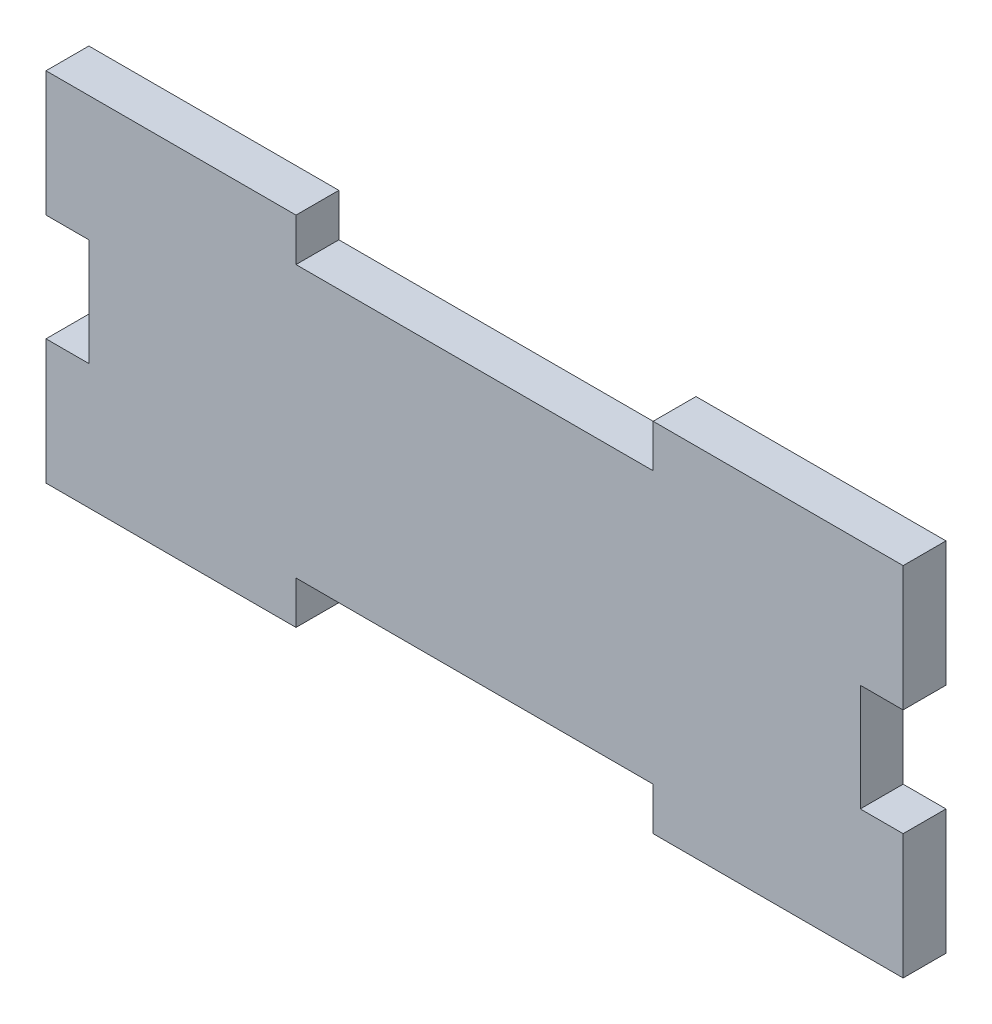
ISO-10303-21;
HEADER;
FILE_DESCRIPTION(('STEP AP214'),'2;1');
FILE_NAME('part.step','',(''),(''),'','','');
FILE_SCHEMA(('AUTOMOTIVE_DESIGN { 1 0 10303 214 1 1 1 1 }'));
ENDSEC;
DATA;
#1=APPLICATION_CONTEXT('core data for automotive mechanical design processes');
#2=APPLICATION_PROTOCOL_DEFINITION('international standard','automotive_design',2000,#1);
#3=PRODUCT_CONTEXT('',#1,'mechanical');
#4=PRODUCT('Part','Part','',(#3));
#5=PRODUCT_RELATED_PRODUCT_CATEGORY('part','',(#4));
#6=PRODUCT_DEFINITION_FORMATION('','',#4);
#7=PRODUCT_DEFINITION_CONTEXT('part definition',#1,'design');
#8=PRODUCT_DEFINITION('design','',#6,#7);
#9=PRODUCT_DEFINITION_SHAPE('','',#8);
#10=(LENGTH_UNIT() NAMED_UNIT(*) SI_UNIT(.MILLI.,.METRE.));
#11=(NAMED_UNIT(*) PLANE_ANGLE_UNIT() SI_UNIT($,.RADIAN.));
#12=(NAMED_UNIT(*) SI_UNIT($,.STERADIAN.) SOLID_ANGLE_UNIT());
#13=UNCERTAINTY_MEASURE_WITH_UNIT(LENGTH_MEASURE(1.E-05),#10,'distance_accuracy_value','');
#14=(GEOMETRIC_REPRESENTATION_CONTEXT(3) GLOBAL_UNCERTAINTY_ASSIGNED_CONTEXT((#13)) GLOBAL_UNIT_ASSIGNED_CONTEXT((#10,
#11,#12)) REPRESENTATION_CONTEXT('',''));
#15=CARTESIAN_POINT('',(0.,0.,0.));
#16=DIRECTION('',(0.,0.,1.));
#17=DIRECTION('',(1.,0.,0.));
#18=AXIS2_PLACEMENT_3D('',#15,#16,#17);
#19=CARTESIAN_POINT('',(25.,19.,6.));
#20=DIRECTION('',(1.,0.,0.));
#21=DIRECTION('',(0.,0.,-1.));
#22=AXIS2_PLACEMENT_3D('',#19,#20,#21);
#23=PLANE('',#22);
#24=DIRECTION('',(0.,-1.,0.));
#25=VECTOR('',#24,1.);
#26=CARTESIAN_POINT('',(25.,19.,0.));
#27=LINE('',#26,#25);
#28=CARTESIAN_POINT('',(25.,25.,0.));
#29=VERTEX_POINT('',#28);
#30=CARTESIAN_POINT('',(25.,19.,0.));
#31=VERTEX_POINT('',#30);
#32=EDGE_CURVE('E203',#29,#31,#27,.T.);
#33=ORIENTED_EDGE('',*,*,#32,.T.);
#34=DIRECTION('',(0.,0.,-1.));
#35=VECTOR('',#34,1.);
#36=CARTESIAN_POINT('',(25.,19.,6.));
#37=LINE('',#36,#35);
#38=CARTESIAN_POINT('',(25.,19.,6.));
#39=VERTEX_POINT('',#38);
#40=EDGE_CURVE('E11',#39,#31,#37,.T.);
#41=ORIENTED_EDGE('',*,*,#40,.F.);
#42=DIRECTION('',(0.,-1.,0.));
#43=VECTOR('',#42,1.);
#44=CARTESIAN_POINT('',(25.,19.,6.));
#45=LINE('',#44,#43);
#46=CARTESIAN_POINT('',(25.,25.,6.));
#47=VERTEX_POINT('',#46);
#48=EDGE_CURVE('E241',#47,#39,#45,.T.);
#49=ORIENTED_EDGE('',*,*,#48,.F.);
#50=DIRECTION('',(0.,0.,-1.));
#51=VECTOR('',#50,1.);
#52=CARTESIAN_POINT('',(25.,25.,6.));
#53=LINE('',#52,#51);
#54=EDGE_CURVE('E199',#47,#29,#53,.T.);
#55=ORIENTED_EDGE('',*,*,#54,.T.);
#56=EDGE_LOOP('',(#33,#41,#49,#55));
#57=FACE_BOUND('',#56,.T.);
#58=ADVANCED_FACE('F35',(#57),#23,.F.);
#59=CARTESIAN_POINT('',(-25.,19.,6.));
#60=DIRECTION('',(0.,-1.,0.));
#61=DIRECTION('',(0.,0.,-1.));
#62=AXIS2_PLACEMENT_3D('',#59,#60,#61);
#63=PLANE('',#62);
#64=DIRECTION('',(-1.,0.,0.));
#65=VECTOR('',#64,1.);
#66=CARTESIAN_POINT('',(-25.,19.,0.));
#67=LINE('',#66,#65);
#68=CARTESIAN_POINT('',(-25.,19.,0.));
#69=VERTEX_POINT('',#68);
#70=EDGE_CURVE('E206',#31,#69,#67,.T.);
#71=ORIENTED_EDGE('',*,*,#70,.T.);
#72=DIRECTION('',(0.,0.,-1.));
#73=VECTOR('',#72,1.);
#74=CARTESIAN_POINT('',(-25.,19.,6.));
#75=LINE('',#74,#73);
#76=CARTESIAN_POINT('',(-25.,19.,6.));
#77=VERTEX_POINT('',#76);
#78=EDGE_CURVE('E43',#77,#69,#75,.T.);
#79=ORIENTED_EDGE('',*,*,#78,.F.);
#80=DIRECTION('',(-1.,0.,0.));
#81=VECTOR('',#80,1.);
#82=CARTESIAN_POINT('',(-25.,19.,6.));
#83=LINE('',#82,#81);
#84=EDGE_CURVE('E130',#39,#77,#83,.T.);
#85=ORIENTED_EDGE('',*,*,#84,.F.);
#86=ORIENTED_EDGE('',*,*,#40,.T.);
#87=EDGE_LOOP('',(#71,#79,#85,#86));
#88=FACE_BOUND('',#87,.T.);
#89=ADVANCED_FACE('F359',(#88),#63,.F.);
#90=CARTESIAN_POINT('',(-25.,19.,6.));
#91=DIRECTION('',(-1.,0.,0.));
#92=DIRECTION('',(0.,0.,1.));
#93=AXIS2_PLACEMENT_3D('',#90,#91,#92);
#94=PLANE('',#93);
#95=DIRECTION('',(0.,1.,0.));
#96=VECTOR('',#95,1.);
#97=CARTESIAN_POINT('',(-25.,19.,0.));
#98=LINE('',#97,#96);
#99=CARTESIAN_POINT('',(-25.,25.,0.));
#100=VERTEX_POINT('',#99);
#101=EDGE_CURVE('E208',#69,#100,#98,.T.);
#102=ORIENTED_EDGE('',*,*,#101,.T.);
#103=DIRECTION('',(0.,0.,-1.));
#104=VECTOR('',#103,1.);
#105=CARTESIAN_POINT('',(-25.,25.,6.));
#106=LINE('',#105,#104);
#107=CARTESIAN_POINT('',(-25.,25.,6.));
#108=VERTEX_POINT('',#107);
#109=EDGE_CURVE('E284',#108,#100,#106,.T.);
#110=ORIENTED_EDGE('',*,*,#109,.F.);
#111=DIRECTION('',(0.,1.,0.));
#112=VECTOR('',#111,1.);
#113=CARTESIAN_POINT('',(-25.,19.,6.));
#114=LINE('',#113,#112);
#115=EDGE_CURVE('E292',#77,#108,#114,.T.);
#116=ORIENTED_EDGE('',*,*,#115,.F.);
#117=ORIENTED_EDGE('',*,*,#78,.T.);
#118=EDGE_LOOP('',(#102,#110,#116,#117));
#119=FACE_BOUND('',#118,.T.);
#120=ADVANCED_FACE('F290',(#119),#94,.F.);
#121=CARTESIAN_POINT('',(-25.,25.,6.));
#122=DIRECTION('',(0.,-1.,0.));
#123=DIRECTION('',(1.,0.,0.));
#124=AXIS2_PLACEMENT_3D('',#121,#122,#123);
#125=PLANE('',#124);
#126=DIRECTION('',(-1.,0.,0.));
#127=VECTOR('',#126,1.);
#128=CARTESIAN_POINT('',(-25.,25.,0.));
#129=LINE('',#128,#127);
#130=CARTESIAN_POINT('',(-60.,25.,0.));
#131=VERTEX_POINT('',#130);
#132=EDGE_CURVE('E210',#100,#131,#129,.T.);
#133=ORIENTED_EDGE('',*,*,#132,.T.);
#134=DIRECTION('',(0.,0.,-1.));
#135=VECTOR('',#134,1.);
#136=CARTESIAN_POINT('',(-60.,25.,6.));
#137=LINE('',#136,#135);
#138=CARTESIAN_POINT('',(-60.,25.,6.));
#139=VERTEX_POINT('',#138);
#140=EDGE_CURVE('E281',#139,#131,#137,.T.);
#141=ORIENTED_EDGE('',*,*,#140,.F.);
#142=DIRECTION('',(-1.,0.,0.));
#143=VECTOR('',#142,1.);
#144=CARTESIAN_POINT('',(-25.,25.,6.));
#145=LINE('',#144,#143);
#146=EDGE_CURVE('E310',#108,#139,#145,.T.);
#147=ORIENTED_EDGE('',*,*,#146,.F.);
#148=ORIENTED_EDGE('',*,*,#109,.T.);
#149=EDGE_LOOP('',(#133,#141,#147,#148));
#150=FACE_BOUND('',#149,.T.);
#151=ADVANCED_FACE('F301',(#150),#125,.F.);
#152=CARTESIAN_POINT('',(-60.,7.5,6.));
#153=DIRECTION('',(1.,0.,0.));
#154=DIRECTION('',(0.,0.,-1.));
#155=AXIS2_PLACEMENT_3D('',#152,#153,#154);
#156=PLANE('',#155);
#157=DIRECTION('',(0.,-1.,0.));
#158=VECTOR('',#157,1.);
#159=CARTESIAN_POINT('',(-60.,7.5,0.));
#160=LINE('',#159,#158);
#161=CARTESIAN_POINT('',(-60.,7.5,0.));
#162=VERTEX_POINT('',#161);
#163=EDGE_CURVE('E212',#131,#162,#160,.T.);
#164=ORIENTED_EDGE('',*,*,#163,.T.);
#165=DIRECTION('',(0.,0.,-1.));
#166=VECTOR('',#165,1.);
#167=CARTESIAN_POINT('',(-60.,7.5,6.));
#168=LINE('',#167,#166);
#169=CARTESIAN_POINT('',(-60.,7.5,6.));
#170=VERTEX_POINT('',#169);
#171=EDGE_CURVE('E278',#170,#162,#168,.T.);
#172=ORIENTED_EDGE('',*,*,#171,.F.);
#173=DIRECTION('',(0.,-1.,0.));
#174=VECTOR('',#173,1.);
#175=CARTESIAN_POINT('',(-60.,7.5,6.));
#176=LINE('',#175,#174);
#177=EDGE_CURVE('E307',#139,#170,#176,.T.);
#178=ORIENTED_EDGE('',*,*,#177,.F.);
#179=ORIENTED_EDGE('',*,*,#140,.T.);
#180=EDGE_LOOP('',(#164,#172,#178,#179));
#181=FACE_BOUND('',#180,.T.);
#182=ADVANCED_FACE('F305',(#181),#156,.F.);
#183=CARTESIAN_POINT('',(-60.,7.5,6.));
#184=DIRECTION('',(0.,1.,0.));
#185=DIRECTION('',(-1.,0.,0.));
#186=AXIS2_PLACEMENT_3D('',#183,#184,#185);
#187=PLANE('',#186);
#188=DIRECTION('',(1.,0.,0.));
#189=VECTOR('',#188,1.);
#190=CARTESIAN_POINT('',(-60.,7.5,0.));
#191=LINE('',#190,#189);
#192=CARTESIAN_POINT('',(-54.,7.5,0.));
#193=VERTEX_POINT('',#192);
#194=EDGE_CURVE('E214',#162,#193,#191,.T.);
#195=ORIENTED_EDGE('',*,*,#194,.T.);
#196=DIRECTION('',(0.,0.,-1.));
#197=VECTOR('',#196,1.);
#198=CARTESIAN_POINT('',(-54.,7.5,6.));
#199=LINE('',#198,#197);
#200=CARTESIAN_POINT('',(-54.,7.5,6.));
#201=VERTEX_POINT('',#200);
#202=EDGE_CURVE('E275',#201,#193,#199,.T.);
#203=ORIENTED_EDGE('',*,*,#202,.F.);
#204=DIRECTION('',(1.,0.,0.));
#205=VECTOR('',#204,1.);
#206=CARTESIAN_POINT('',(-60.,7.5,6.));
#207=LINE('',#206,#205);
#208=EDGE_CURVE('E309',#170,#201,#207,.T.);
#209=ORIENTED_EDGE('',*,*,#208,.F.);
#210=ORIENTED_EDGE('',*,*,#171,.T.);
#211=EDGE_LOOP('',(#195,#203,#209,#210));
#212=FACE_BOUND('',#211,.T.);
#213=ADVANCED_FACE('F372',(#212),#187,.F.);
#214=CARTESIAN_POINT('',(-54.,7.5,6.));
#215=DIRECTION('',(1.,0.,0.));
#216=DIRECTION('',(0.,0.,-1.));
#217=AXIS2_PLACEMENT_3D('',#214,#215,#216);
#218=PLANE('',#217);
#219=DIRECTION('',(0.,-1.,0.));
#220=VECTOR('',#219,1.);
#221=CARTESIAN_POINT('',(-54.,7.5,0.));
#222=LINE('',#221,#220);
#223=CARTESIAN_POINT('',(-54.,-7.5,0.));
#224=VERTEX_POINT('',#223);
#225=EDGE_CURVE('E216',#193,#224,#222,.T.);
#226=ORIENTED_EDGE('',*,*,#225,.T.);
#227=DIRECTION('',(0.,0.,-1.));
#228=VECTOR('',#227,1.);
#229=CARTESIAN_POINT('',(-54.,-7.5,6.));
#230=LINE('',#229,#228);
#231=CARTESIAN_POINT('',(-54.,-7.5,6.));
#232=VERTEX_POINT('',#231);
#233=EDGE_CURVE('E272',#232,#224,#230,.T.);
#234=ORIENTED_EDGE('',*,*,#233,.F.);
#235=DIRECTION('',(0.,-1.,0.));
#236=VECTOR('',#235,1.);
#237=CARTESIAN_POINT('',(-54.,7.5,6.));
#238=LINE('',#237,#236);
#239=EDGE_CURVE('E312',#201,#232,#238,.T.);
#240=ORIENTED_EDGE('',*,*,#239,.F.);
#241=ORIENTED_EDGE('',*,*,#202,.T.);
#242=EDGE_LOOP('',(#226,#234,#240,#241));
#243=FACE_BOUND('',#242,.T.);
#244=ADVANCED_FACE('F375',(#243),#218,.F.);
#245=CARTESIAN_POINT('',(-60.,-7.5,6.));
#246=DIRECTION('',(0.,-1.,0.));
#247=DIRECTION('',(1.,0.,0.));
#248=AXIS2_PLACEMENT_3D('',#245,#246,#247);
#249=PLANE('',#248);
#250=DIRECTION('',(-1.,0.,0.));
#251=VECTOR('',#250,1.);
#252=CARTESIAN_POINT('',(-60.,-7.5,0.));
#253=LINE('',#252,#251);
#254=CARTESIAN_POINT('',(-60.,-7.5,0.));
#255=VERTEX_POINT('',#254);
#256=EDGE_CURVE('E218',#224,#255,#253,.T.);
#257=ORIENTED_EDGE('',*,*,#256,.T.);
#258=DIRECTION('',(0.,0.,-1.));
#259=VECTOR('',#258,1.);
#260=CARTESIAN_POINT('',(-60.,-7.5,6.));
#261=LINE('',#260,#259);
#262=CARTESIAN_POINT('',(-60.,-7.5,6.));
#263=VERTEX_POINT('',#262);
#264=EDGE_CURVE('E269',#263,#255,#261,.T.);
#265=ORIENTED_EDGE('',*,*,#264,.F.);
#266=DIRECTION('',(-1.,0.,0.));
#267=VECTOR('',#266,1.);
#268=CARTESIAN_POINT('',(-60.,-7.5,6.));
#269=LINE('',#268,#267);
#270=EDGE_CURVE('E318',#232,#263,#269,.T.);
#271=ORIENTED_EDGE('',*,*,#270,.F.);
#272=ORIENTED_EDGE('',*,*,#233,.T.);
#273=EDGE_LOOP('',(#257,#265,#271,#272));
#274=FACE_BOUND('',#273,.T.);
#275=ADVANCED_FACE('F379',(#274),#249,.F.);
#276=CARTESIAN_POINT('',(-60.,-25.,6.));
#277=DIRECTION('',(1.,0.,0.));
#278=DIRECTION('',(0.,0.,-1.));
#279=AXIS2_PLACEMENT_3D('',#276,#277,#278);
#280=PLANE('',#279);
#281=DIRECTION('',(0.,-1.,0.));
#282=VECTOR('',#281,1.);
#283=CARTESIAN_POINT('',(-60.,-25.,0.));
#284=LINE('',#283,#282);
#285=CARTESIAN_POINT('',(-60.,-25.,0.));
#286=VERTEX_POINT('',#285);
#287=EDGE_CURVE('E220',#255,#286,#284,.T.);
#288=ORIENTED_EDGE('',*,*,#287,.T.);
#289=DIRECTION('',(0.,0.,-1.));
#290=VECTOR('',#289,1.);
#291=CARTESIAN_POINT('',(-60.,-25.,6.));
#292=LINE('',#291,#290);
#293=CARTESIAN_POINT('',(-60.,-25.,6.));
#294=VERTEX_POINT('',#293);
#295=EDGE_CURVE('E266',#294,#286,#292,.T.);
#296=ORIENTED_EDGE('',*,*,#295,.F.);
#297=DIRECTION('',(0.,-1.,0.));
#298=VECTOR('',#297,1.);
#299=CARTESIAN_POINT('',(-60.,-25.,6.));
#300=LINE('',#299,#298);
#301=EDGE_CURVE('E320',#263,#294,#300,.T.);
#302=ORIENTED_EDGE('',*,*,#301,.F.);
#303=ORIENTED_EDGE('',*,*,#264,.T.);
#304=EDGE_LOOP('',(#288,#296,#302,#303));
#305=FACE_BOUND('',#304,.T.);
#306=ADVANCED_FACE('F383',(#305),#280,.F.);
#307=CARTESIAN_POINT('',(-25.,-25.,6.));
#308=DIRECTION('',(0.,1.,0.));
#309=DIRECTION('',(-1.,0.,0.));
#310=AXIS2_PLACEMENT_3D('',#307,#308,#309);
#311=PLANE('',#310);
#312=DIRECTION('',(1.,0.,0.));
#313=VECTOR('',#312,1.);
#314=CARTESIAN_POINT('',(-25.,-25.,0.));
#315=LINE('',#314,#313);
#316=CARTESIAN_POINT('',(-25.,-25.,0.));
#317=VERTEX_POINT('',#316);
#318=EDGE_CURVE('E222',#286,#317,#315,.T.);
#319=ORIENTED_EDGE('',*,*,#318,.T.);
#320=DIRECTION('',(0.,0.,-1.));
#321=VECTOR('',#320,1.);
#322=CARTESIAN_POINT('',(-25.,-25.,6.));
#323=LINE('',#322,#321);
#324=CARTESIAN_POINT('',(-25.,-25.,6.));
#325=VERTEX_POINT('',#324);
#326=EDGE_CURVE('E263',#325,#317,#323,.T.);
#327=ORIENTED_EDGE('',*,*,#326,.F.);
#328=DIRECTION('',(1.,0.,0.));
#329=VECTOR('',#328,1.);
#330=CARTESIAN_POINT('',(-25.,-25.,6.));
#331=LINE('',#330,#329);
#332=EDGE_CURVE('E322',#294,#325,#331,.T.);
#333=ORIENTED_EDGE('',*,*,#332,.F.);
#334=ORIENTED_EDGE('',*,*,#295,.T.);
#335=EDGE_LOOP('',(#319,#327,#333,#334));
#336=FACE_BOUND('',#335,.T.);
#337=ADVANCED_FACE('F387',(#336),#311,.F.);
#338=CARTESIAN_POINT('',(-25.,-19.,6.));
#339=DIRECTION('',(-1.,0.,0.));
#340=DIRECTION('',(0.,0.,1.));
#341=AXIS2_PLACEMENT_3D('',#338,#339,#340);
#342=PLANE('',#341);
#343=DIRECTION('',(0.,1.,0.));
#344=VECTOR('',#343,1.);
#345=CARTESIAN_POINT('',(-25.,-19.,0.));
#346=LINE('',#345,#344);
#347=CARTESIAN_POINT('',(-25.,-19.,0.));
#348=VERTEX_POINT('',#347);
#349=EDGE_CURVE('E224',#317,#348,#346,.T.);
#350=ORIENTED_EDGE('',*,*,#349,.T.);
#351=DIRECTION('',(0.,0.,-1.));
#352=VECTOR('',#351,1.);
#353=CARTESIAN_POINT('',(-25.,-19.,6.));
#354=LINE('',#353,#352);
#355=CARTESIAN_POINT('',(-25.,-19.,6.));
#356=VERTEX_POINT('',#355);
#357=EDGE_CURVE('E260',#356,#348,#354,.T.);
#358=ORIENTED_EDGE('',*,*,#357,.F.);
#359=DIRECTION('',(0.,1.,0.));
#360=VECTOR('',#359,1.);
#361=CARTESIAN_POINT('',(-25.,-19.,6.));
#362=LINE('',#361,#360);
#363=EDGE_CURVE('E324',#325,#356,#362,.T.);
#364=ORIENTED_EDGE('',*,*,#363,.F.);
#365=ORIENTED_EDGE('',*,*,#326,.T.);
#366=EDGE_LOOP('',(#350,#358,#364,#365));
#367=FACE_BOUND('',#366,.T.);
#368=ADVANCED_FACE('F391',(#367),#342,.F.);
#369=CARTESIAN_POINT('',(-25.,-19.,6.));
#370=DIRECTION('',(0.,1.,0.));
#371=DIRECTION('',(0.,0.,1.));
#372=AXIS2_PLACEMENT_3D('',#369,#370,#371);
#373=PLANE('',#372);
#374=DIRECTION('',(1.,0.,0.));
#375=VECTOR('',#374,1.);
#376=CARTESIAN_POINT('',(-25.,-19.,0.));
#377=LINE('',#376,#375);
#378=CARTESIAN_POINT('',(25.,-19.,0.));
#379=VERTEX_POINT('',#378);
#380=EDGE_CURVE('E226',#348,#379,#377,.T.);
#381=ORIENTED_EDGE('',*,*,#380,.T.);
#382=DIRECTION('',(0.,0.,-1.));
#383=VECTOR('',#382,1.);
#384=CARTESIAN_POINT('',(25.,-19.,6.));
#385=LINE('',#384,#383);
#386=CARTESIAN_POINT('',(25.,-19.,6.));
#387=VERTEX_POINT('',#386);
#388=EDGE_CURVE('E257',#387,#379,#385,.T.);
#389=ORIENTED_EDGE('',*,*,#388,.F.);
#390=DIRECTION('',(1.,0.,0.));
#391=VECTOR('',#390,1.);
#392=CARTESIAN_POINT('',(-25.,-19.,6.));
#393=LINE('',#392,#391);
#394=EDGE_CURVE('E326',#356,#387,#393,.T.);
#395=ORIENTED_EDGE('',*,*,#394,.F.);
#396=ORIENTED_EDGE('',*,*,#357,.T.);
#397=EDGE_LOOP('',(#381,#389,#395,#396));
#398=FACE_BOUND('',#397,.T.);
#399=ADVANCED_FACE('F395',(#398),#373,.F.);
#400=CARTESIAN_POINT('',(25.,-19.,6.));
#401=DIRECTION('',(1.,0.,0.));
#402=DIRECTION('',(0.,0.,-1.));
#403=AXIS2_PLACEMENT_3D('',#400,#401,#402);
#404=PLANE('',#403);
#405=DIRECTION('',(0.,-1.,0.));
#406=VECTOR('',#405,1.);
#407=CARTESIAN_POINT('',(25.,-19.,0.));
#408=LINE('',#407,#406);
#409=CARTESIAN_POINT('',(25.,-25.,0.));
#410=VERTEX_POINT('',#409);
#411=EDGE_CURVE('E228',#379,#410,#408,.T.);
#412=ORIENTED_EDGE('',*,*,#411,.T.);
#413=DIRECTION('',(0.,0.,-1.));
#414=VECTOR('',#413,1.);
#415=CARTESIAN_POINT('',(25.,-25.,6.));
#416=LINE('',#415,#414);
#417=CARTESIAN_POINT('',(25.,-25.,6.));
#418=VERTEX_POINT('',#417);
#419=EDGE_CURVE('E254',#418,#410,#416,.T.);
#420=ORIENTED_EDGE('',*,*,#419,.F.);
#421=DIRECTION('',(0.,-1.,0.));
#422=VECTOR('',#421,1.);
#423=CARTESIAN_POINT('',(25.,-19.,6.));
#424=LINE('',#423,#422);
#425=EDGE_CURVE('E328',#387,#418,#424,.T.);
#426=ORIENTED_EDGE('',*,*,#425,.F.);
#427=ORIENTED_EDGE('',*,*,#388,.T.);
#428=EDGE_LOOP('',(#412,#420,#426,#427));
#429=FACE_BOUND('',#428,.T.);
#430=ADVANCED_FACE('F399',(#429),#404,.F.);
#431=CARTESIAN_POINT('',(25.,-25.,6.));
#432=DIRECTION('',(0.,1.,0.));
#433=DIRECTION('',(-1.,0.,0.));
#434=AXIS2_PLACEMENT_3D('',#431,#432,#433);
#435=PLANE('',#434);
#436=DIRECTION('',(1.,0.,0.));
#437=VECTOR('',#436,1.);
#438=CARTESIAN_POINT('',(25.,-25.,0.));
#439=LINE('',#438,#437);
#440=CARTESIAN_POINT('',(60.,-25.,0.));
#441=VERTEX_POINT('',#440);
#442=EDGE_CURVE('E230',#410,#441,#439,.T.);
#443=ORIENTED_EDGE('',*,*,#442,.T.);
#444=DIRECTION('',(0.,0.,-1.));
#445=VECTOR('',#444,1.);
#446=CARTESIAN_POINT('',(60.,-25.,6.));
#447=LINE('',#446,#445);
#448=CARTESIAN_POINT('',(60.,-25.,6.));
#449=VERTEX_POINT('',#448);
#450=EDGE_CURVE('E251',#449,#441,#447,.T.);
#451=ORIENTED_EDGE('',*,*,#450,.F.);
#452=DIRECTION('',(1.,0.,0.));
#453=VECTOR('',#452,1.);
#454=CARTESIAN_POINT('',(25.,-25.,6.));
#455=LINE('',#454,#453);
#456=EDGE_CURVE('E330',#418,#449,#455,.T.);
#457=ORIENTED_EDGE('',*,*,#456,.F.);
#458=ORIENTED_EDGE('',*,*,#419,.T.);
#459=EDGE_LOOP('',(#443,#451,#457,#458));
#460=FACE_BOUND('',#459,.T.);
#461=ADVANCED_FACE('F403',(#460),#435,.F.);
#462=CARTESIAN_POINT('',(60.,-25.,6.));
#463=DIRECTION('',(-1.,0.,0.));
#464=DIRECTION('',(0.,0.,1.));
#465=AXIS2_PLACEMENT_3D('',#462,#463,#464);
#466=PLANE('',#465);
#467=DIRECTION('',(0.,1.,0.));
#468=VECTOR('',#467,1.);
#469=CARTESIAN_POINT('',(60.,-25.,0.));
#470=LINE('',#469,#468);
#471=CARTESIAN_POINT('',(60.,-7.5,0.));
#472=VERTEX_POINT('',#471);
#473=EDGE_CURVE('E232',#441,#472,#470,.T.);
#474=ORIENTED_EDGE('',*,*,#473,.T.);
#475=DIRECTION('',(0.,0.,-1.));
#476=VECTOR('',#475,1.);
#477=CARTESIAN_POINT('',(60.,-7.5,6.));
#478=LINE('',#477,#476);
#479=CARTESIAN_POINT('',(60.,-7.5,6.));
#480=VERTEX_POINT('',#479);
#481=EDGE_CURVE('E248',#480,#472,#478,.T.);
#482=ORIENTED_EDGE('',*,*,#481,.F.);
#483=DIRECTION('',(0.,1.,0.));
#484=VECTOR('',#483,1.);
#485=CARTESIAN_POINT('',(60.,-25.,6.));
#486=LINE('',#485,#484);
#487=EDGE_CURVE('E332',#449,#480,#486,.T.);
#488=ORIENTED_EDGE('',*,*,#487,.F.);
#489=ORIENTED_EDGE('',*,*,#450,.T.);
#490=EDGE_LOOP('',(#474,#482,#488,#489));
#491=FACE_BOUND('',#490,.T.);
#492=ADVANCED_FACE('F407',(#491),#466,.F.);
#493=CARTESIAN_POINT('',(60.,-7.5,6.));
#494=DIRECTION('',(0.,-1.,0.));
#495=DIRECTION('',(1.,0.,0.));
#496=AXIS2_PLACEMENT_3D('',#493,#494,#495);
#497=PLANE('',#496);
#498=DIRECTION('',(-1.,0.,0.));
#499=VECTOR('',#498,1.);
#500=CARTESIAN_POINT('',(60.,-7.5,0.));
#501=LINE('',#500,#499);
#502=CARTESIAN_POINT('',(54.,-7.5,0.));
#503=VERTEX_POINT('',#502);
#504=EDGE_CURVE('E234',#472,#503,#501,.T.);
#505=ORIENTED_EDGE('',*,*,#504,.T.);
#506=DIRECTION('',(0.,0.,-1.));
#507=VECTOR('',#506,1.);
#508=CARTESIAN_POINT('',(54.,-7.5,6.));
#509=LINE('',#508,#507);
#510=CARTESIAN_POINT('',(54.,-7.5,6.));
#511=VERTEX_POINT('',#510);
#512=EDGE_CURVE('E245',#511,#503,#509,.T.);
#513=ORIENTED_EDGE('',*,*,#512,.F.);
#514=DIRECTION('',(-1.,0.,0.));
#515=VECTOR('',#514,1.);
#516=CARTESIAN_POINT('',(60.,-7.5,6.));
#517=LINE('',#516,#515);
#518=EDGE_CURVE('E334',#480,#511,#517,.T.);
#519=ORIENTED_EDGE('',*,*,#518,.F.);
#520=ORIENTED_EDGE('',*,*,#481,.T.);
#521=EDGE_LOOP('',(#505,#513,#519,#520));
#522=FACE_BOUND('',#521,.T.);
#523=ADVANCED_FACE('F340',(#522),#497,.F.);
#524=CARTESIAN_POINT('',(54.,7.5,6.));
#525=DIRECTION('',(-1.,0.,0.));
#526=DIRECTION('',(0.,0.,1.));
#527=AXIS2_PLACEMENT_3D('',#524,#525,#526);
#528=PLANE('',#527);
#529=DIRECTION('',(0.,1.,0.));
#530=VECTOR('',#529,1.);
#531=CARTESIAN_POINT('',(54.,7.5,0.));
#532=LINE('',#531,#530);
#533=CARTESIAN_POINT('',(54.,7.5,0.));
#534=VERTEX_POINT('',#533);
#535=EDGE_CURVE('E236',#503,#534,#532,.T.);
#536=ORIENTED_EDGE('',*,*,#535,.T.);
#537=DIRECTION('',(0.,0.,-1.));
#538=VECTOR('',#537,1.);
#539=CARTESIAN_POINT('',(54.,7.5,6.));
#540=LINE('',#539,#538);
#541=CARTESIAN_POINT('',(54.,7.5,6.));
#542=VERTEX_POINT('',#541);
#543=EDGE_CURVE('E194',#542,#534,#540,.T.);
#544=ORIENTED_EDGE('',*,*,#543,.F.);
#545=DIRECTION('',(0.,1.,0.));
#546=VECTOR('',#545,1.);
#547=CARTESIAN_POINT('',(54.,7.5,6.));
#548=LINE('',#547,#546);
#549=EDGE_CURVE('E185',#511,#542,#548,.T.);
#550=ORIENTED_EDGE('',*,*,#549,.F.);
#551=ORIENTED_EDGE('',*,*,#512,.T.);
#552=EDGE_LOOP('',(#536,#544,#550,#551));
#553=FACE_BOUND('',#552,.T.);
#554=ADVANCED_FACE('F344',(#553),#528,.F.);
#555=CARTESIAN_POINT('',(60.,7.5,6.));
#556=DIRECTION('',(0.,1.,0.));
#557=DIRECTION('',(-1.,0.,0.));
#558=AXIS2_PLACEMENT_3D('',#555,#556,#557);
#559=PLANE('',#558);
#560=DIRECTION('',(1.,0.,0.));
#561=VECTOR('',#560,1.);
#562=CARTESIAN_POINT('',(60.,7.5,0.));
#563=LINE('',#562,#561);
#564=CARTESIAN_POINT('',(60.,7.5,0.));
#565=VERTEX_POINT('',#564);
#566=EDGE_CURVE('E193',#534,#565,#563,.T.);
#567=ORIENTED_EDGE('',*,*,#566,.T.);
#568=DIRECTION('',(0.,0.,-1.));
#569=VECTOR('',#568,1.);
#570=CARTESIAN_POINT('',(60.,7.5,6.));
#571=LINE('',#570,#569);
#572=CARTESIAN_POINT('',(60.,7.5,6.));
#573=VERTEX_POINT('',#572);
#574=EDGE_CURVE('E190',#573,#565,#571,.T.);
#575=ORIENTED_EDGE('',*,*,#574,.F.);
#576=DIRECTION('',(1.,0.,0.));
#577=VECTOR('',#576,1.);
#578=CARTESIAN_POINT('',(60.,7.5,6.));
#579=LINE('',#578,#577);
#580=EDGE_CURVE('E179',#542,#573,#579,.T.);
#581=ORIENTED_EDGE('',*,*,#580,.F.);
#582=ORIENTED_EDGE('',*,*,#543,.T.);
#583=EDGE_LOOP('',(#567,#575,#581,#582));
#584=FACE_BOUND('',#583,.T.);
#585=ADVANCED_FACE('F191',(#584),#559,.F.);
#586=CARTESIAN_POINT('',(60.,7.5,6.));
#587=DIRECTION('',(-1.,0.,0.));
#588=DIRECTION('',(0.,0.,1.));
#589=AXIS2_PLACEMENT_3D('',#586,#587,#588);
#590=PLANE('',#589);
#591=DIRECTION('',(0.,1.,0.));
#592=VECTOR('',#591,1.);
#593=CARTESIAN_POINT('',(60.,7.5,0.));
#594=LINE('',#593,#592);
#595=CARTESIAN_POINT('',(60.,25.,0.));
#596=VERTEX_POINT('',#595);
#597=EDGE_CURVE('E116',#565,#596,#594,.T.);
#598=ORIENTED_EDGE('',*,*,#597,.T.);
#599=DIRECTION('',(0.,0.,-1.));
#600=VECTOR('',#599,1.);
#601=CARTESIAN_POINT('',(60.,25.,6.));
#602=LINE('',#601,#600);
#603=CARTESIAN_POINT('',(60.,25.,6.));
#604=VERTEX_POINT('',#603);
#605=EDGE_CURVE('E195',#604,#596,#602,.T.);
#606=ORIENTED_EDGE('',*,*,#605,.F.);
#607=DIRECTION('',(0.,1.,0.));
#608=VECTOR('',#607,1.);
#609=CARTESIAN_POINT('',(60.,7.5,6.));
#610=LINE('',#609,#608);
#611=EDGE_CURVE('E183',#573,#604,#610,.T.);
#612=ORIENTED_EDGE('',*,*,#611,.F.);
#613=ORIENTED_EDGE('',*,*,#574,.T.);
#614=EDGE_LOOP('',(#598,#606,#612,#613));
#615=FACE_BOUND('',#614,.T.);
#616=ADVANCED_FACE('F197',(#615),#590,.F.);
#617=CARTESIAN_POINT('',(25.,25.,6.));
#618=DIRECTION('',(0.,-1.,0.));
#619=DIRECTION('',(1.,0.,0.));
#620=AXIS2_PLACEMENT_3D('',#617,#618,#619);
#621=PLANE('',#620);
#622=DIRECTION('',(-1.,0.,0.));
#623=VECTOR('',#622,1.);
#624=CARTESIAN_POINT('',(25.,25.,0.));
#625=LINE('',#624,#623);
#626=EDGE_CURVE('E122',#596,#29,#625,.T.);
#627=ORIENTED_EDGE('',*,*,#626,.T.);
#628=ORIENTED_EDGE('',*,*,#54,.F.);
#629=DIRECTION('',(-1.,0.,0.));
#630=VECTOR('',#629,1.);
#631=CARTESIAN_POINT('',(25.,25.,6.));
#632=LINE('',#631,#630);
#633=EDGE_CURVE('E51',#604,#47,#632,.T.);
#634=ORIENTED_EDGE('',*,*,#633,.F.);
#635=ORIENTED_EDGE('',*,*,#605,.T.);
#636=EDGE_LOOP('',(#627,#628,#634,#635));
#637=FACE_BOUND('',#636,.T.);
#638=ADVANCED_FACE('F348',(#637),#621,.F.);
#639=CARTESIAN_POINT('',(0.,0.,6.));
#640=DIRECTION('',(0.,0.,-1.));
#641=DIRECTION('',(-1.,0.,0.));
#642=AXIS2_PLACEMENT_3D('',#639,#640,#641);
#643=PLANE('',#642);
#644=ORIENTED_EDGE('',*,*,#48,.T.);
#645=ORIENTED_EDGE('',*,*,#84,.T.);
#646=ORIENTED_EDGE('',*,*,#115,.T.);
#647=ORIENTED_EDGE('',*,*,#146,.T.);
#648=ORIENTED_EDGE('',*,*,#177,.T.);
#649=ORIENTED_EDGE('',*,*,#208,.T.);
#650=ORIENTED_EDGE('',*,*,#239,.T.);
#651=ORIENTED_EDGE('',*,*,#270,.T.);
#652=ORIENTED_EDGE('',*,*,#301,.T.);
#653=ORIENTED_EDGE('',*,*,#332,.T.);
#654=ORIENTED_EDGE('',*,*,#363,.T.);
#655=ORIENTED_EDGE('',*,*,#394,.T.);
#656=ORIENTED_EDGE('',*,*,#425,.T.);
#657=ORIENTED_EDGE('',*,*,#456,.T.);
#658=ORIENTED_EDGE('',*,*,#487,.T.);
#659=ORIENTED_EDGE('',*,*,#518,.T.);
#660=ORIENTED_EDGE('',*,*,#549,.T.);
#661=ORIENTED_EDGE('',*,*,#580,.T.);
#662=ORIENTED_EDGE('',*,*,#611,.T.);
#663=ORIENTED_EDGE('',*,*,#633,.T.);
#664=EDGE_LOOP('',(#644,#645,#646,#647,#648,#649,#650,#651,#652,#653,#654,#655,#656,#657,#658,
#659,#660,#661,#662,#663));
#665=FACE_BOUND('',#664,.T.);
#666=ADVANCED_FACE('F181',(#665),#643,.F.);
#667=CARTESIAN_POINT('',(0.,0.,0.));
#668=DIRECTION('',(0.,0.,-1.));
#669=DIRECTION('',(-1.,0.,0.));
#670=AXIS2_PLACEMENT_3D('',#667,#668,#669);
#671=PLANE('',#670);
#672=ORIENTED_EDGE('',*,*,#32,.F.);
#673=ORIENTED_EDGE('',*,*,#626,.F.);
#674=ORIENTED_EDGE('',*,*,#597,.F.);
#675=ORIENTED_EDGE('',*,*,#566,.F.);
#676=ORIENTED_EDGE('',*,*,#535,.F.);
#677=ORIENTED_EDGE('',*,*,#504,.F.);
#678=ORIENTED_EDGE('',*,*,#473,.F.);
#679=ORIENTED_EDGE('',*,*,#442,.F.);
#680=ORIENTED_EDGE('',*,*,#411,.F.);
#681=ORIENTED_EDGE('',*,*,#380,.F.);
#682=ORIENTED_EDGE('',*,*,#349,.F.);
#683=ORIENTED_EDGE('',*,*,#318,.F.);
#684=ORIENTED_EDGE('',*,*,#287,.F.);
#685=ORIENTED_EDGE('',*,*,#256,.F.);
#686=ORIENTED_EDGE('',*,*,#225,.F.);
#687=ORIENTED_EDGE('',*,*,#194,.F.);
#688=ORIENTED_EDGE('',*,*,#163,.F.);
#689=ORIENTED_EDGE('',*,*,#132,.F.);
#690=ORIENTED_EDGE('',*,*,#101,.F.);
#691=ORIENTED_EDGE('',*,*,#70,.F.);
#692=EDGE_LOOP('',(#672,#673,#674,#675,#676,#677,#678,#679,#680,#681,#682,#683,#684,#685,#686,
#687,#688,#689,#690,#691));
#693=FACE_BOUND('',#692,.T.);
#694=ADVANCED_FACE('F296',(#693),#671,.T.);
#695=CLOSED_SHELL('',(#58,#89,#120,#151,#182,#213,#244,#275,#306,#337,#368,#399,#430,#461,#492,
#523,#554,#585,#616,#638,#666,#694));
#696=MANIFOLD_SOLID_BREP('B2',#695);
#697=ADVANCED_BREP_SHAPE_REPRESENTATION('',(#18,#696),#14);
#698=SHAPE_DEFINITION_REPRESENTATION(#9,#697);
ENDSEC;
END-ISO-10303-21;
